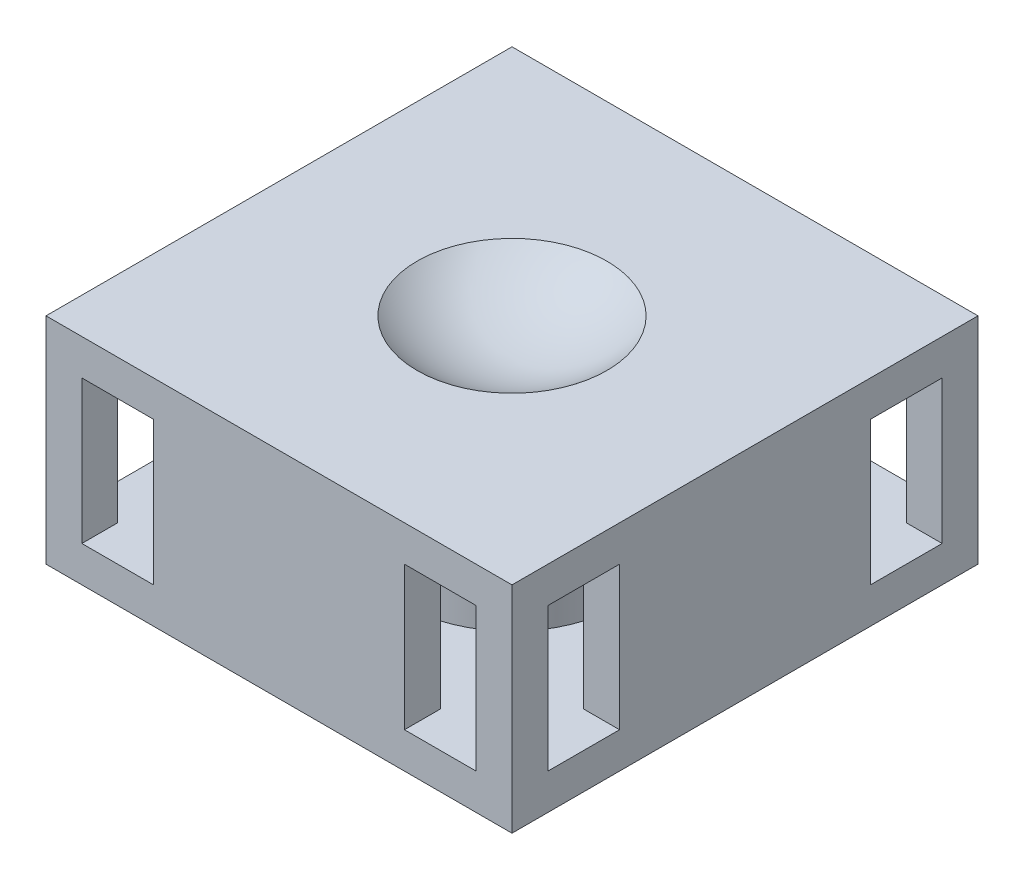
ISO-10303-21;
HEADER;
FILE_DESCRIPTION(('STEP AP214'),'2;1');
FILE_NAME('part.step','',(''),(''),'','','');
FILE_SCHEMA(('AUTOMOTIVE_DESIGN { 1 0 10303 214 1 1 1 1 }'));
ENDSEC;
DATA;
#1=APPLICATION_CONTEXT('core data for automotive mechanical design processes');
#2=APPLICATION_PROTOCOL_DEFINITION('international standard','automotive_design',2000,#1);
#3=PRODUCT_CONTEXT('',#1,'mechanical');
#4=PRODUCT('Part','Part','',(#3));
#5=PRODUCT_RELATED_PRODUCT_CATEGORY('part','',(#4));
#6=PRODUCT_DEFINITION_FORMATION('','',#4);
#7=PRODUCT_DEFINITION_CONTEXT('part definition',#1,'design');
#8=PRODUCT_DEFINITION('design','',#6,#7);
#9=PRODUCT_DEFINITION_SHAPE('','',#8);
#10=(LENGTH_UNIT() NAMED_UNIT(*) SI_UNIT(.MILLI.,.METRE.));
#11=(NAMED_UNIT(*) PLANE_ANGLE_UNIT() SI_UNIT($,.RADIAN.));
#12=(NAMED_UNIT(*) SI_UNIT($,.STERADIAN.) SOLID_ANGLE_UNIT());
#13=UNCERTAINTY_MEASURE_WITH_UNIT(LENGTH_MEASURE(1.E-05),#10,'distance_accuracy_value','');
#14=(GEOMETRIC_REPRESENTATION_CONTEXT(3) GLOBAL_UNCERTAINTY_ASSIGNED_CONTEXT((#13)) GLOBAL_UNIT_ASSIGNED_CONTEXT((#10,
#11,#12)) REPRESENTATION_CONTEXT('',''));
#15=CARTESIAN_POINT('',(0.,0.,0.));
#16=DIRECTION('',(0.,0.,1.));
#17=DIRECTION('',(1.,0.,0.));
#18=AXIS2_PLACEMENT_3D('',#15,#16,#17);
#19=CARTESIAN_POINT('',(77.4408521018582,-20.,40.9027976581447));
#20=DIRECTION('',(0.,0.,1.));
#21=DIRECTION('',(1.,0.,0.));
#22=AXIS2_PLACEMENT_3D('',#19,#20,#21);
#23=PLANE('',#22);
#24=DIRECTION('',(-1.,0.,0.));
#25=VECTOR('',#24,1.);
#26=CARTESIAN_POINT('',(77.4408521018582,-40.,40.9027976581447));
#27=LINE('',#26,#25);
#28=CARTESIAN_POINT('',(77.4408521018582,-40.,40.9027976581447));
#29=VERTEX_POINT('',#28);
#30=CARTESIAN_POINT('',(72.4408521018581,-40.,40.9027976581447));
#31=VERTEX_POINT('',#30);
#32=EDGE_CURVE('E500',#29,#31,#27,.T.);
#33=ORIENTED_EDGE('',*,*,#32,.T.);
#34=DIRECTION('',(0.,1.,0.));
#35=VECTOR('',#34,1.);
#36=CARTESIAN_POINT('',(72.4408521018581,-20.,40.9027976581447));
#37=LINE('',#36,#35);
#38=CARTESIAN_POINT('',(72.4408521018581,-20.,40.9027976581447));
#39=VERTEX_POINT('',#38);
#40=EDGE_CURVE('E303',#31,#39,#37,.T.);
#41=ORIENTED_EDGE('',*,*,#40,.T.);
#42=DIRECTION('',(-1.,0.,0.));
#43=VECTOR('',#42,1.);
#44=CARTESIAN_POINT('',(77.4408521018582,-20.,40.9027976581447));
#45=LINE('',#44,#43);
#46=CARTESIAN_POINT('',(77.4408521018582,-20.,40.9027976581447));
#47=VERTEX_POINT('',#46);
#48=EDGE_CURVE('E444',#47,#39,#45,.T.);
#49=ORIENTED_EDGE('',*,*,#48,.F.);
#50=DIRECTION('',(0.,1.,0.));
#51=VECTOR('',#50,1.);
#52=CARTESIAN_POINT('',(77.4408521018582,-20.,40.9027976581447));
#53=LINE('',#52,#51);
#54=EDGE_CURVE('E482',#29,#47,#53,.T.);
#55=ORIENTED_EDGE('',*,*,#54,.F.);
#56=EDGE_LOOP('',(#33,#41,#49,#55));
#57=FACE_BOUND('',#56,.T.);
#58=ADVANCED_FACE('F39',(#57),#23,.F.);
#59=CARTESIAN_POINT('',(62.4408521018581,-20.,40.9027976581447));
#60=VERTEX_POINT('',#59);
#61=CARTESIAN_POINT('',(27.4408521018581,-20.,40.9027976581447));
#62=VERTEX_POINT('',#61);
#63=EDGE_CURVE('E498',#60,#62,#45,.T.);
#64=ORIENTED_EDGE('',*,*,#63,.F.);
#65=DIRECTION('',(0.,-1.,0.));
#66=VECTOR('',#65,1.);
#67=CARTESIAN_POINT('',(62.4408521018581,-20.,40.9027976581447));
#68=LINE('',#67,#66);
#69=CARTESIAN_POINT('',(62.4408521018581,-40.,40.9027976581447));
#70=VERTEX_POINT('',#69);
#71=EDGE_CURVE('E412',#60,#70,#68,.T.);
#72=ORIENTED_EDGE('',*,*,#71,.T.);
#73=CARTESIAN_POINT('',(27.4408521018581,-40.,40.9027976581447));
#74=VERTEX_POINT('',#73);
#75=EDGE_CURVE('E502',#70,#74,#27,.T.);
#76=ORIENTED_EDGE('',*,*,#75,.T.);
#77=DIRECTION('',(0.,1.,0.));
#78=VECTOR('',#77,1.);
#79=CARTESIAN_POINT('',(27.4408521018581,-20.,40.9027976581447));
#80=LINE('',#79,#78);
#81=EDGE_CURVE('E406',#74,#62,#80,.T.);
#82=ORIENTED_EDGE('',*,*,#81,.T.);
#83=EDGE_LOOP('',(#64,#72,#76,#82));
#84=FACE_BOUND('',#83,.T.);
#85=ADVANCED_FACE('F661',(#84),#23,.F.);
#86=CARTESIAN_POINT('',(77.4408521018582,-20.,30.9027976581447));
#87=DIRECTION('',(0.,0.,-1.));
#88=DIRECTION('',(0.,1.,0.));
#89=AXIS2_PLACEMENT_3D('',#86,#87,#88);
#90=PLANE('',#89);
#91=DIRECTION('',(-1.,0.,0.));
#92=VECTOR('',#91,1.);
#93=CARTESIAN_POINT('',(77.4408521018582,-20.,30.9027976581447));
#94=LINE('',#93,#92);
#95=CARTESIAN_POINT('',(77.4408521018582,-20.,30.9027976581447));
#96=VERTEX_POINT('',#95);
#97=CARTESIAN_POINT('',(72.4408521018581,-20.,30.9027976581447));
#98=VERTEX_POINT('',#97);
#99=EDGE_CURVE('E509',#96,#98,#94,.T.);
#100=ORIENTED_EDGE('',*,*,#99,.T.);
#101=DIRECTION('',(0.,-1.,0.));
#102=VECTOR('',#101,1.);
#103=CARTESIAN_POINT('',(72.4408521018581,-20.,30.9027976581447));
#104=LINE('',#103,#102);
#105=CARTESIAN_POINT('',(72.4408521018581,-40.,30.9027976581447));
#106=VERTEX_POINT('',#105);
#107=EDGE_CURVE('E421',#98,#106,#104,.T.);
#108=ORIENTED_EDGE('',*,*,#107,.T.);
#109=DIRECTION('',(-1.,0.,0.));
#110=VECTOR('',#109,1.);
#111=CARTESIAN_POINT('',(77.4408521018582,-40.,30.9027976581447));
#112=LINE('',#111,#110);
#113=CARTESIAN_POINT('',(77.4408521018581,-40.,30.9027976581447));
#114=VERTEX_POINT('',#113);
#115=EDGE_CURVE('E504',#114,#106,#112,.T.);
#116=ORIENTED_EDGE('',*,*,#115,.F.);
#117=DIRECTION('',(0.,-1.,0.));
#118=VECTOR('',#117,1.);
#119=CARTESIAN_POINT('',(77.4408521018582,-20.,30.9027976581447));
#120=LINE('',#119,#118);
#121=EDGE_CURVE('E475',#96,#114,#120,.T.);
#122=ORIENTED_EDGE('',*,*,#121,.F.);
#123=EDGE_LOOP('',(#100,#108,#116,#122));
#124=FACE_BOUND('',#123,.T.);
#125=ADVANCED_FACE('F705',(#124),#90,.F.);
#126=CARTESIAN_POINT('',(47.4408521018581,-20.,30.9027976581447));
#127=VERTEX_POINT('',#126);
#128=CARTESIAN_POINT('',(42.4408521018581,-20.,30.9027976581447));
#129=VERTEX_POINT('',#128);
#130=EDGE_CURVE('E512',#127,#129,#94,.T.);
#131=ORIENTED_EDGE('',*,*,#130,.T.);
#132=DIRECTION('',(0.,-1.,0.));
#133=VECTOR('',#132,1.);
#134=CARTESIAN_POINT('',(42.4408521018581,-20.,30.9027976581447));
#135=LINE('',#134,#133);
#136=CARTESIAN_POINT('',(42.4408521018581,-40.,30.9027976581447));
#137=VERTEX_POINT('',#136);
#138=EDGE_CURVE('E560',#129,#137,#135,.T.);
#139=ORIENTED_EDGE('',*,*,#138,.T.);
#140=CARTESIAN_POINT('',(47.4408521018581,-40.,30.9027976581447));
#141=VERTEX_POINT('',#140);
#142=EDGE_CURVE('E507',#141,#137,#112,.T.);
#143=ORIENTED_EDGE('',*,*,#142,.F.);
#144=DIRECTION('',(0.,1.,0.));
#145=VECTOR('',#144,1.);
#146=CARTESIAN_POINT('',(47.4408521018581,-20.,30.9027976581447));
#147=LINE('',#146,#145);
#148=EDGE_CURVE('E557',#141,#127,#147,.T.);
#149=ORIENTED_EDGE('',*,*,#148,.T.);
#150=EDGE_LOOP('',(#131,#139,#143,#149));
#151=FACE_BOUND('',#150,.T.);
#152=ADVANCED_FACE('F714',(#151),#90,.F.);
#153=CARTESIAN_POINT('',(77.4408521018581,-20.,-14.0972023418553));
#154=DIRECTION('',(0.,0.,-1.));
#155=DIRECTION('',(-1.,0.,0.));
#156=AXIS2_PLACEMENT_3D('',#153,#154,#155);
#157=PLANE('',#156);
#158=DIRECTION('',(-1.,0.,0.));
#159=VECTOR('',#158,1.);
#160=CARTESIAN_POINT('',(77.4408521018581,-20.,-14.0972023418553));
#161=LINE('',#160,#159);
#162=CARTESIAN_POINT('',(77.4408521018581,-20.,-14.0972023418553));
#163=VERTEX_POINT('',#162);
#164=CARTESIAN_POINT('',(72.4408521018581,-20.,-14.0972023418553));
#165=VERTEX_POINT('',#164);
#166=EDGE_CURVE('E452',#163,#165,#161,.T.);
#167=ORIENTED_EDGE('',*,*,#166,.T.);
#168=DIRECTION('',(0.,-1.,0.));
#169=VECTOR('',#168,1.);
#170=CARTESIAN_POINT('',(72.4408521018581,-20.,-14.0972023418553));
#171=LINE('',#170,#169);
#172=CARTESIAN_POINT('',(72.4408521018581,-40.,-14.0972023418553));
#173=VERTEX_POINT('',#172);
#174=EDGE_CURVE('E418',#165,#173,#171,.T.);
#175=ORIENTED_EDGE('',*,*,#174,.T.);
#176=DIRECTION('',(-1.,0.,0.));
#177=VECTOR('',#176,1.);
#178=CARTESIAN_POINT('',(77.4408521018581,-40.,-14.0972023418553));
#179=LINE('',#178,#177);
#180=CARTESIAN_POINT('',(77.4408521018581,-40.,-14.0972023418553));
#181=VERTEX_POINT('',#180);
#182=EDGE_CURVE('E468',#181,#173,#179,.T.);
#183=ORIENTED_EDGE('',*,*,#182,.F.);
#184=DIRECTION('',(0.,-1.,0.));
#185=VECTOR('',#184,1.);
#186=CARTESIAN_POINT('',(77.4408521018581,-20.,-14.0972023418553));
#187=LINE('',#186,#185);
#188=EDGE_CURVE('E426',#163,#181,#187,.T.);
#189=ORIENTED_EDGE('',*,*,#188,.F.);
#190=EDGE_LOOP('',(#167,#175,#183,#189));
#191=FACE_BOUND('',#190,.T.);
#192=ADVANCED_FACE('F747',(#191),#157,.F.);
#193=CARTESIAN_POINT('',(62.4408521018581,-40.,-14.0972023418553));
#194=VERTEX_POINT('',#193);
#195=CARTESIAN_POINT('',(27.4408521018581,-40.,-14.0972023418553));
#196=VERTEX_POINT('',#195);
#197=EDGE_CURVE('E471',#194,#196,#179,.T.);
#198=ORIENTED_EDGE('',*,*,#197,.F.);
#199=DIRECTION('',(0.,1.,0.));
#200=VECTOR('',#199,1.);
#201=CARTESIAN_POINT('',(62.4408521018581,-20.,-14.0972023418553));
#202=LINE('',#201,#200);
#203=CARTESIAN_POINT('',(62.4408521018581,-20.,-14.0972023418553));
#204=VERTEX_POINT('',#203);
#205=EDGE_CURVE('E409',#194,#204,#202,.T.);
#206=ORIENTED_EDGE('',*,*,#205,.T.);
#207=CARTESIAN_POINT('',(27.4408521018581,-20.,-14.0972023418553));
#208=VERTEX_POINT('',#207);
#209=EDGE_CURVE('E456',#204,#208,#161,.T.);
#210=ORIENTED_EDGE('',*,*,#209,.T.);
#211=DIRECTION('',(0.,-1.,0.));
#212=VECTOR('',#211,1.);
#213=CARTESIAN_POINT('',(27.4408521018581,-20.,-14.0972023418553));
#214=LINE('',#213,#212);
#215=EDGE_CURVE('E403',#208,#196,#214,.T.);
#216=ORIENTED_EDGE('',*,*,#215,.T.);
#217=EDGE_LOOP('',(#198,#206,#210,#216));
#218=FACE_BOUND('',#217,.T.);
#219=ADVANCED_FACE('F614',(#218),#157,.F.);
#220=CARTESIAN_POINT('',(77.4408521018581,-20.,-4.09720234185532));
#221=DIRECTION('',(0.,0.,1.));
#222=DIRECTION('',(0.,-1.,0.));
#223=AXIS2_PLACEMENT_3D('',#220,#221,#222);
#224=PLANE('',#223);
#225=DIRECTION('',(-1.,0.,0.));
#226=VECTOR('',#225,1.);
#227=CARTESIAN_POINT('',(77.4408521018581,-40.,-4.09720234185531));
#228=LINE('',#227,#226);
#229=CARTESIAN_POINT('',(77.4408521018581,-40.,-4.0972023418553));
#230=VERTEX_POINT('',#229);
#231=CARTESIAN_POINT('',(72.4408521018581,-40.,-4.09720234185531));
#232=VERTEX_POINT('',#231);
#233=EDGE_CURVE('E463',#230,#232,#228,.T.);
#234=ORIENTED_EDGE('',*,*,#233,.T.);
#235=DIRECTION('',(0.,1.,0.));
#236=VECTOR('',#235,1.);
#237=CARTESIAN_POINT('',(72.4408521018581,-20.,-4.09720234185531));
#238=LINE('',#237,#236);
#239=CARTESIAN_POINT('',(72.4408521018581,-20.,-4.09720234185532));
#240=VERTEX_POINT('',#239);
#241=EDGE_CURVE('E415',#232,#240,#238,.T.);
#242=ORIENTED_EDGE('',*,*,#241,.T.);
#243=DIRECTION('',(-1.,0.,0.));
#244=VECTOR('',#243,1.);
#245=CARTESIAN_POINT('',(77.4408521018581,-20.,-4.09720234185532));
#246=LINE('',#245,#244);
#247=CARTESIAN_POINT('',(77.4408521018581,-20.,-4.09720234185532));
#248=VERTEX_POINT('',#247);
#249=EDGE_CURVE('E458',#248,#240,#246,.T.);
#250=ORIENTED_EDGE('',*,*,#249,.F.);
#251=DIRECTION('',(0.,1.,0.));
#252=VECTOR('',#251,1.);
#253=CARTESIAN_POINT('',(77.4408521018581,-20.,-4.09720234185532));
#254=LINE('',#253,#252);
#255=EDGE_CURVE('E433',#230,#248,#254,.T.);
#256=ORIENTED_EDGE('',*,*,#255,.F.);
#257=EDGE_LOOP('',(#234,#242,#250,#256));
#258=FACE_BOUND('',#257,.T.);
#259=ADVANCED_FACE('F696',(#258),#224,.F.);
#260=CARTESIAN_POINT('',(47.4408521018581,-40.,-4.09720234185531));
#261=VERTEX_POINT('',#260);
#262=CARTESIAN_POINT('',(42.4408521018581,-40.,-4.09720234185531));
#263=VERTEX_POINT('',#262);
#264=EDGE_CURVE('E466',#261,#263,#228,.T.);
#265=ORIENTED_EDGE('',*,*,#264,.T.);
#266=DIRECTION('',(0.,1.,0.));
#267=VECTOR('',#266,1.);
#268=CARTESIAN_POINT('',(42.4408521018581,-20.,-4.09720234185531));
#269=LINE('',#268,#267);
#270=CARTESIAN_POINT('',(42.4408521018581,-20.,-4.09720234185531));
#271=VERTEX_POINT('',#270);
#272=EDGE_CURVE('E550',#263,#271,#269,.T.);
#273=ORIENTED_EDGE('',*,*,#272,.T.);
#274=CARTESIAN_POINT('',(47.4408521018581,-20.,-4.09720234185531));
#275=VERTEX_POINT('',#274);
#276=EDGE_CURVE('E461',#275,#271,#246,.T.);
#277=ORIENTED_EDGE('',*,*,#276,.F.);
#278=DIRECTION('',(0.,-1.,0.));
#279=VECTOR('',#278,1.);
#280=CARTESIAN_POINT('',(47.4408521018581,-20.,-4.09720234185531));
#281=LINE('',#280,#279);
#282=EDGE_CURVE('E537',#275,#261,#281,.T.);
#283=ORIENTED_EDGE('',*,*,#282,.T.);
#284=EDGE_LOOP('',(#265,#273,#277,#283));
#285=FACE_BOUND('',#284,.T.);
#286=ADVANCED_FACE('F590',(#285),#224,.F.);
#287=CARTESIAN_POINT('',(12.4408521018581,-45.,-19.0972023418553));
#288=DIRECTION('',(-1.,0.,0.));
#289=DIRECTION('',(0.,0.,1.));
#290=AXIS2_PLACEMENT_3D('',#287,#288,#289);
#291=PLANE('',#290);
#292=DIRECTION('',(0.,-1.,0.));
#293=VECTOR('',#292,1.);
#294=CARTESIAN_POINT('',(12.4408521018581,-20.,-14.0972023418553));
#295=LINE('',#294,#293);
#296=CARTESIAN_POINT('',(12.4408521018581,-20.,-14.0972023418553));
#297=VERTEX_POINT('',#296);
#298=CARTESIAN_POINT('',(12.4408521018581,-40.,-14.0972023418553));
#299=VERTEX_POINT('',#298);
#300=EDGE_CURVE('E440',#297,#299,#295,.T.);
#301=ORIENTED_EDGE('',*,*,#300,.F.);
#302=DIRECTION('',(0.,0.,-1.));
#303=VECTOR('',#302,1.);
#304=CARTESIAN_POINT('',(12.4408521018581,-20.,-14.0972023418553));
#305=LINE('',#304,#303);
#306=CARTESIAN_POINT('',(12.4408521018581,-20.,-4.09720234185531));
#307=VERTEX_POINT('',#306);
#308=EDGE_CURVE('E430',#307,#297,#305,.T.);
#309=ORIENTED_EDGE('',*,*,#308,.F.);
#310=DIRECTION('',(0.,1.,0.));
#311=VECTOR('',#310,1.);
#312=CARTESIAN_POINT('',(12.4408521018581,-20.,-4.09720234185531));
#313=LINE('',#312,#311);
#314=CARTESIAN_POINT('',(12.4408521018581,-40.,-4.0972023418553));
#315=VERTEX_POINT('',#314);
#316=EDGE_CURVE('E447',#315,#307,#313,.T.);
#317=ORIENTED_EDGE('',*,*,#316,.F.);
#318=DIRECTION('',(0.,0.,1.));
#319=VECTOR('',#318,1.);
#320=CARTESIAN_POINT('',(12.4408521018581,-40.,-14.0972023418553));
#321=LINE('',#320,#319);
#322=EDGE_CURVE('E443',#299,#315,#321,.T.);
#323=ORIENTED_EDGE('',*,*,#322,.F.);
#324=EDGE_LOOP('',(#301,#309,#317,#323));
#325=FACE_BOUND('',#324,.T.);
#326=DIRECTION('',(0.,0.,-1.));
#327=VECTOR('',#326,1.);
#328=CARTESIAN_POINT('',(12.4408521018581,-20.,30.9027976581447));
#329=LINE('',#328,#327);
#330=CARTESIAN_POINT('',(12.4408521018581,-20.,40.9027976581447));
#331=VERTEX_POINT('',#330);
#332=CARTESIAN_POINT('',(12.4408521018581,-20.,30.9027976581447));
#333=VERTEX_POINT('',#332);
#334=EDGE_CURVE('E425',#331,#333,#329,.T.);
#335=ORIENTED_EDGE('',*,*,#334,.F.);
#336=DIRECTION('',(0.,1.,0.));
#337=VECTOR('',#336,1.);
#338=CARTESIAN_POINT('',(12.4408521018581,-20.,40.9027976581447));
#339=LINE('',#338,#337);
#340=CARTESIAN_POINT('',(12.4408521018581,-40.,40.9027976581447));
#341=VERTEX_POINT('',#340);
#342=EDGE_CURVE('E476',#341,#331,#339,.T.);
#343=ORIENTED_EDGE('',*,*,#342,.F.);
#344=DIRECTION('',(0.,0.,1.));
#345=VECTOR('',#344,1.);
#346=CARTESIAN_POINT('',(12.4408521018581,-40.,30.9027976581447));
#347=LINE('',#346,#345);
#348=CARTESIAN_POINT('',(12.4408521018581,-40.,30.9027976581447));
#349=VERTEX_POINT('',#348);
#350=EDGE_CURVE('E491',#349,#341,#347,.T.);
#351=ORIENTED_EDGE('',*,*,#350,.F.);
#352=DIRECTION('',(0.,-1.,0.));
#353=VECTOR('',#352,1.);
#354=CARTESIAN_POINT('',(12.4408521018581,-20.,30.9027976581447));
#355=LINE('',#354,#353);
#356=EDGE_CURVE('E488',#333,#349,#355,.T.);
#357=ORIENTED_EDGE('',*,*,#356,.F.);
#358=EDGE_LOOP('',(#335,#343,#351,#357));
#359=FACE_BOUND('',#358,.T.);
#360=DIRECTION('',(0.,1.,0.));
#361=VECTOR('',#360,1.);
#362=CARTESIAN_POINT('',(12.4408521018581,-45.,45.9027976581447));
#363=LINE('',#362,#361);
#364=CARTESIAN_POINT('',(12.4408521018581,-45.,45.9027976581447));
#365=VERTEX_POINT('',#364);
#366=CARTESIAN_POINT('',(12.4408521018581,-15.,45.9027976581447));
#367=VERTEX_POINT('',#366);
#368=EDGE_CURVE('E533',#365,#367,#363,.T.);
#369=ORIENTED_EDGE('',*,*,#368,.T.);
#370=DIRECTION('',(0.,0.,1.));
#371=VECTOR('',#370,1.);
#372=CARTESIAN_POINT('',(12.4408521018581,-15.,-19.0972023418553));
#373=LINE('',#372,#371);
#374=CARTESIAN_POINT('',(12.4408521018581,-15.,-19.0972023418553));
#375=VERTEX_POINT('',#374);
#376=EDGE_CURVE('E455',#375,#367,#373,.T.);
#377=ORIENTED_EDGE('',*,*,#376,.F.);
#378=DIRECTION('',(0.,1.,0.));
#379=VECTOR('',#378,1.);
#380=CARTESIAN_POINT('',(12.4408521018581,-45.,-19.0972023418553));
#381=LINE('',#380,#379);
#382=CARTESIAN_POINT('',(12.4408521018581,-45.,-19.0972023418553));
#383=VERTEX_POINT('',#382);
#384=EDGE_CURVE('E534',#383,#375,#381,.T.);
#385=ORIENTED_EDGE('',*,*,#384,.F.);
#386=DIRECTION('',(0.,0.,1.));
#387=VECTOR('',#386,1.);
#388=CARTESIAN_POINT('',(12.4408521018581,-45.,-19.0972023418553));
#389=LINE('',#388,#387);
#390=EDGE_CURVE('E521',#383,#365,#389,.T.);
#391=ORIENTED_EDGE('',*,*,#390,.T.);
#392=EDGE_LOOP('',(#369,#377,#385,#391));
#393=FACE_BOUND('',#392,.T.);
#394=ADVANCED_FACE('F604',(#325,#359,#393),#291,.T.);
#395=CARTESIAN_POINT('',(12.4408521018581,-45.,-19.0972023418553));
#396=DIRECTION('',(0.,0.,-1.));
#397=DIRECTION('',(-1.,0.,0.));
#398=AXIS2_PLACEMENT_3D('',#395,#396,#397);
#399=PLANE('',#398);
#400=DIRECTION('',(0.,-1.,0.));
#401=VECTOR('',#400,1.);
#402=CARTESIAN_POINT('',(72.4408521018581,-20.,-19.0972023418553));
#403=LINE('',#402,#401);
#404=CARTESIAN_POINT('',(72.4408521018581,-20.,-19.0972023418553));
#405=VERTEX_POINT('',#404);
#406=CARTESIAN_POINT('',(72.4408521018581,-40.,-19.0972023418553));
#407=VERTEX_POINT('',#406);
#408=EDGE_CURVE('E333',#405,#407,#403,.T.);
#409=ORIENTED_EDGE('',*,*,#408,.F.);
#410=DIRECTION('',(1.,0.,0.));
#411=VECTOR('',#410,1.);
#412=CARTESIAN_POINT('',(72.4408521018581,-20.,-19.0972023418553));
#413=LINE('',#412,#411);
#414=CARTESIAN_POINT('',(62.4408521018581,-20.,-19.0972023418553));
#415=VERTEX_POINT('',#414);
#416=EDGE_CURVE('E325',#415,#405,#413,.T.);
#417=ORIENTED_EDGE('',*,*,#416,.F.);
#418=DIRECTION('',(0.,1.,0.));
#419=VECTOR('',#418,1.);
#420=CARTESIAN_POINT('',(62.4408521018581,-20.,-19.0972023418553));
#421=LINE('',#420,#419);
#422=CARTESIAN_POINT('',(62.4408521018581,-40.,-19.0972023418553));
#423=VERTEX_POINT('',#422);
#424=EDGE_CURVE('E328',#423,#415,#421,.T.);
#425=ORIENTED_EDGE('',*,*,#424,.F.);
#426=DIRECTION('',(-1.,0.,0.));
#427=VECTOR('',#426,1.);
#428=CARTESIAN_POINT('',(72.4408521018581,-40.,-19.0972023418553));
#429=LINE('',#428,#427);
#430=EDGE_CURVE('E335',#407,#423,#429,.T.);
#431=ORIENTED_EDGE('',*,*,#430,.F.);
#432=EDGE_LOOP('',(#409,#417,#425,#431));
#433=FACE_BOUND('',#432,.T.);
#434=DIRECTION('',(0.,-1.,0.));
#435=VECTOR('',#434,1.);
#436=CARTESIAN_POINT('',(27.4408521018581,-20.,-19.0972023418553));
#437=LINE('',#436,#435);
#438=CARTESIAN_POINT('',(27.4408521018581,-20.,-19.0972023418553));
#439=VERTEX_POINT('',#438);
#440=CARTESIAN_POINT('',(27.4408521018581,-40.,-19.0972023418553));
#441=VERTEX_POINT('',#440);
#442=EDGE_CURVE('E367',#439,#441,#437,.T.);
#443=ORIENTED_EDGE('',*,*,#442,.F.);
#444=DIRECTION('',(1.,0.,0.));
#445=VECTOR('',#444,1.);
#446=CARTESIAN_POINT('',(27.4408521018581,-20.,-19.0972023418553));
#447=LINE('',#446,#445);
#448=CARTESIAN_POINT('',(17.4408521018581,-20.,-19.0972023418553));
#449=VERTEX_POINT('',#448);
#450=EDGE_CURVE('E357',#449,#439,#447,.T.);
#451=ORIENTED_EDGE('',*,*,#450,.F.);
#452=DIRECTION('',(0.,1.,0.));
#453=VECTOR('',#452,1.);
#454=CARTESIAN_POINT('',(17.4408521018581,-20.,-19.0972023418553));
#455=LINE('',#454,#453);
#456=CARTESIAN_POINT('',(17.4408521018581,-40.,-19.0972023418553));
#457=VERTEX_POINT('',#456);
#458=EDGE_CURVE('E372',#457,#449,#455,.T.);
#459=ORIENTED_EDGE('',*,*,#458,.F.);
#460=DIRECTION('',(-1.,0.,0.));
#461=VECTOR('',#460,1.);
#462=CARTESIAN_POINT('',(27.4408521018581,-40.,-19.0972023418553));
#463=LINE('',#462,#461);
#464=EDGE_CURVE('E369',#441,#457,#463,.T.);
#465=ORIENTED_EDGE('',*,*,#464,.F.);
#466=EDGE_LOOP('',(#443,#451,#459,#465));
#467=FACE_BOUND('',#466,.T.);
#468=ORIENTED_EDGE('',*,*,#384,.T.);
#469=DIRECTION('',(-1.,0.,0.));
#470=VECTOR('',#469,1.);
#471=CARTESIAN_POINT('',(12.4408521018581,-15.,-19.0972023418553));
#472=LINE('',#471,#470);
#473=CARTESIAN_POINT('',(77.4408521018581,-15.,-19.0972023418553));
#474=VERTEX_POINT('',#473);
#475=EDGE_CURVE('E518',#474,#375,#472,.T.);
#476=ORIENTED_EDGE('',*,*,#475,.F.);
#477=DIRECTION('',(0.,1.,0.));
#478=VECTOR('',#477,1.);
#479=CARTESIAN_POINT('',(77.4408521018581,-45.,-19.0972023418553));
#480=LINE('',#479,#478);
#481=CARTESIAN_POINT('',(77.4408521018581,-45.,-19.0972023418553));
#482=VERTEX_POINT('',#481);
#483=EDGE_CURVE('E538',#482,#474,#480,.T.);
#484=ORIENTED_EDGE('',*,*,#483,.F.);
#485=DIRECTION('',(-1.,0.,0.));
#486=VECTOR('',#485,1.);
#487=CARTESIAN_POINT('',(12.4408521018581,-45.,-19.0972023418553));
#488=LINE('',#487,#486);
#489=EDGE_CURVE('E530',#482,#383,#488,.T.);
#490=ORIENTED_EDGE('',*,*,#489,.T.);
#491=EDGE_LOOP('',(#468,#476,#484,#490));
#492=FACE_BOUND('',#491,.T.);
#493=ADVANCED_FACE('F638',(#433,#467,#492),#399,.T.);
#494=CARTESIAN_POINT('',(77.4408521018581,-45.,-19.0972023418553));
#495=DIRECTION('',(1.,0.,0.));
#496=DIRECTION('',(0.,0.,-1.));
#497=AXIS2_PLACEMENT_3D('',#494,#495,#496);
#498=PLANE('',#497);
#499=ORIENTED_EDGE('',*,*,#188,.T.);
#500=DIRECTION('',(0.,0.,1.));
#501=VECTOR('',#500,1.);
#502=CARTESIAN_POINT('',(77.4408521018581,-40.,-14.0972023418553));
#503=LINE('',#502,#501);
#504=EDGE_CURVE('E429',#181,#230,#503,.T.);
#505=ORIENTED_EDGE('',*,*,#504,.T.);
#506=ORIENTED_EDGE('',*,*,#255,.T.);
#507=DIRECTION('',(0.,0.,-1.));
#508=VECTOR('',#507,1.);
#509=CARTESIAN_POINT('',(77.4408521018581,-20.,-14.0972023418553));
#510=LINE('',#509,#508);
#511=EDGE_CURVE('E436',#248,#163,#510,.T.);
#512=ORIENTED_EDGE('',*,*,#511,.T.);
#513=EDGE_LOOP('',(#499,#505,#506,#512));
#514=FACE_BOUND('',#513,.T.);
#515=DIRECTION('',(0.,0.,-1.));
#516=VECTOR('',#515,1.);
#517=CARTESIAN_POINT('',(77.4408521018582,-20.,30.9027976581447));
#518=LINE('',#517,#516);
#519=EDGE_CURVE('E472',#47,#96,#518,.T.);
#520=ORIENTED_EDGE('',*,*,#519,.T.);
#521=ORIENTED_EDGE('',*,*,#121,.T.);
#522=DIRECTION('',(0.,0.,1.));
#523=VECTOR('',#522,1.);
#524=CARTESIAN_POINT('',(77.4408521018582,-40.,30.9027976581447));
#525=LINE('',#524,#523);
#526=EDGE_CURVE('E479',#114,#29,#525,.T.);
#527=ORIENTED_EDGE('',*,*,#526,.T.);
#528=ORIENTED_EDGE('',*,*,#54,.T.);
#529=EDGE_LOOP('',(#520,#521,#527,#528));
#530=FACE_BOUND('',#529,.T.);
#531=ORIENTED_EDGE('',*,*,#483,.T.);
#532=DIRECTION('',(0.,0.,-1.));
#533=VECTOR('',#532,1.);
#534=CARTESIAN_POINT('',(77.4408521018581,-15.,-19.0972023418553));
#535=LINE('',#534,#533);
#536=CARTESIAN_POINT('',(77.4408521018581,-15.,45.9027976581447));
#537=VERTEX_POINT('',#536);
#538=EDGE_CURVE('E516',#537,#474,#535,.T.);
#539=ORIENTED_EDGE('',*,*,#538,.F.);
#540=DIRECTION('',(0.,1.,0.));
#541=VECTOR('',#540,1.);
#542=CARTESIAN_POINT('',(77.4408521018581,-45.,45.9027976581447));
#543=LINE('',#542,#541);
#544=CARTESIAN_POINT('',(77.4408521018581,-45.,45.9027976581447));
#545=VERTEX_POINT('',#544);
#546=EDGE_CURVE('E541',#545,#537,#543,.T.);
#547=ORIENTED_EDGE('',*,*,#546,.F.);
#548=DIRECTION('',(0.,0.,-1.));
#549=VECTOR('',#548,1.);
#550=CARTESIAN_POINT('',(77.4408521018581,-45.,-19.0972023418553));
#551=LINE('',#550,#549);
#552=EDGE_CURVE('E527',#545,#482,#551,.T.);
#553=ORIENTED_EDGE('',*,*,#552,.T.);
#554=EDGE_LOOP('',(#531,#539,#547,#553));
#555=FACE_BOUND('',#554,.T.);
#556=ADVANCED_FACE('F674',(#514,#530,#555),#498,.T.);
#557=CARTESIAN_POINT('',(12.4408521018581,-45.,45.9027976581447));
#558=DIRECTION('',(0.,0.,1.));
#559=DIRECTION('',(1.,0.,0.));
#560=AXIS2_PLACEMENT_3D('',#557,#558,#559);
#561=PLANE('',#560);
#562=DIRECTION('',(0.,-1.,0.));
#563=VECTOR('',#562,1.);
#564=CARTESIAN_POINT('',(72.4408521018581,-20.,45.9027976581447));
#565=LINE('',#564,#563);
#566=CARTESIAN_POINT('',(72.4408521018581,-20.,45.9027976581447));
#567=VERTEX_POINT('',#566);
#568=CARTESIAN_POINT('',(72.4408521018581,-40.,45.9027976581447));
#569=VERTEX_POINT('',#568);
#570=EDGE_CURVE('E300',#567,#569,#565,.T.);
#571=ORIENTED_EDGE('',*,*,#570,.T.);
#572=DIRECTION('',(-1.,0.,0.));
#573=VECTOR('',#572,1.);
#574=CARTESIAN_POINT('',(72.4408521018581,-40.,45.9027976581447));
#575=LINE('',#574,#573);
#576=CARTESIAN_POINT('',(62.4408521018581,-40.,45.9027976581447));
#577=VERTEX_POINT('',#576);
#578=EDGE_CURVE('E312',#569,#577,#575,.T.);
#579=ORIENTED_EDGE('',*,*,#578,.T.);
#580=DIRECTION('',(0.,1.,0.));
#581=VECTOR('',#580,1.);
#582=CARTESIAN_POINT('',(62.4408521018581,-20.,45.9027976581447));
#583=LINE('',#582,#581);
#584=CARTESIAN_POINT('',(62.4408521018581,-20.,45.9027976581447));
#585=VERTEX_POINT('',#584);
#586=EDGE_CURVE('E319',#577,#585,#583,.T.);
#587=ORIENTED_EDGE('',*,*,#586,.T.);
#588=DIRECTION('',(1.,0.,0.));
#589=VECTOR('',#588,1.);
#590=CARTESIAN_POINT('',(72.4408521018581,-20.,45.9027976581447));
#591=LINE('',#590,#589);
#592=EDGE_CURVE('E324',#585,#567,#591,.T.);
#593=ORIENTED_EDGE('',*,*,#592,.T.);
#594=EDGE_LOOP('',(#571,#579,#587,#593));
#595=FACE_BOUND('',#594,.T.);
#596=DIRECTION('',(0.,-1.,0.));
#597=VECTOR('',#596,1.);
#598=CARTESIAN_POINT('',(27.4408521018581,-20.,45.9027976581447));
#599=LINE('',#598,#597);
#600=CARTESIAN_POINT('',(27.4408521018581,-20.,45.9027976581447));
#601=VERTEX_POINT('',#600);
#602=CARTESIAN_POINT('',(27.4408521018581,-40.,45.9027976581447));
#603=VERTEX_POINT('',#602);
#604=EDGE_CURVE('E353',#601,#603,#599,.T.);
#605=ORIENTED_EDGE('',*,*,#604,.T.);
#606=DIRECTION('',(-1.,0.,0.));
#607=VECTOR('',#606,1.);
#608=CARTESIAN_POINT('',(27.4408521018581,-40.,45.9027976581447));
#609=LINE('',#608,#607);
#610=CARTESIAN_POINT('',(17.4408521018581,-40.,45.9027976581447));
#611=VERTEX_POINT('',#610);
#612=EDGE_CURVE('E356',#603,#611,#609,.T.);
#613=ORIENTED_EDGE('',*,*,#612,.T.);
#614=DIRECTION('',(0.,1.,0.));
#615=VECTOR('',#614,1.);
#616=CARTESIAN_POINT('',(17.4408521018581,-20.,45.9027976581447));
#617=LINE('',#616,#615);
#618=CARTESIAN_POINT('',(17.4408521018581,-20.,45.9027976581447));
#619=VERTEX_POINT('',#618);
#620=EDGE_CURVE('E360',#611,#619,#617,.T.);
#621=ORIENTED_EDGE('',*,*,#620,.T.);
#622=DIRECTION('',(1.,0.,0.));
#623=VECTOR('',#622,1.);
#624=CARTESIAN_POINT('',(27.4408521018581,-20.,45.9027976581447));
#625=LINE('',#624,#623);
#626=EDGE_CURVE('E363',#619,#601,#625,.T.);
#627=ORIENTED_EDGE('',*,*,#626,.T.);
#628=EDGE_LOOP('',(#605,#613,#621,#627));
#629=FACE_BOUND('',#628,.T.);
#630=ORIENTED_EDGE('',*,*,#546,.T.);
#631=DIRECTION('',(1.,0.,0.));
#632=VECTOR('',#631,1.);
#633=CARTESIAN_POINT('',(12.4408521018581,-15.,45.9027976581447));
#634=LINE('',#633,#632);
#635=EDGE_CURVE('E514',#367,#537,#634,.T.);
#636=ORIENTED_EDGE('',*,*,#635,.F.);
#637=ORIENTED_EDGE('',*,*,#368,.F.);
#638=DIRECTION('',(1.,0.,0.));
#639=VECTOR('',#638,1.);
#640=CARTESIAN_POINT('',(12.4408521018581,-45.,45.9027976581447));
#641=LINE('',#640,#639);
#642=EDGE_CURVE('E524',#365,#545,#641,.T.);
#643=ORIENTED_EDGE('',*,*,#642,.T.);
#644=EDGE_LOOP('',(#630,#636,#637,#643));
#645=FACE_BOUND('',#644,.T.);
#646=ADVANCED_FACE('F321',(#595,#629,#645),#561,.T.);
#647=CARTESIAN_POINT('',(0.,-45.,0.));
#648=DIRECTION('',(0.,1.,0.));
#649=DIRECTION('',(0.,0.,1.));
#650=AXIS2_PLACEMENT_3D('',#647,#648,#649);
#651=PLANE('',#650);
#652=ORIENTED_EDGE('',*,*,#390,.F.);
#653=ORIENTED_EDGE('',*,*,#489,.F.);
#654=ORIENTED_EDGE('',*,*,#552,.F.);
#655=ORIENTED_EDGE('',*,*,#642,.F.);
#656=EDGE_LOOP('',(#652,#653,#654,#655));
#657=FACE_BOUND('',#656,.T.);
#658=ADVANCED_FACE('F673',(#657),#651,.F.);
#659=CARTESIAN_POINT('',(0.,-15.,0.));
#660=DIRECTION('',(0.,1.,0.));
#661=DIRECTION('',(0.,0.,1.));
#662=AXIS2_PLACEMENT_3D('',#659,#660,#661);
#663=PLANE('',#662);
#664=CARTESIAN_POINT('',(44.9408521018581,-15.,13.4027976581447));
#665=DIRECTION('',(0.,1.,0.));
#666=DIRECTION('',(0.,0.,1.));
#667=AXIS2_PLACEMENT_3D('',#664,#665,#666);
#668=CIRCLE('',#667,13.228756555323);
#669=CARTESIAN_POINT('',(44.9408521018581,-15.,26.6315542134677));
#670=VERTEX_POINT('',#669);
#671=EDGE_CURVE('E520',#670,#670,#668,.T.);
#672=ORIENTED_EDGE('',*,*,#671,.F.);
#673=EDGE_LOOP('',(#672));
#674=FACE_BOUND('',#673,.T.);
#675=ORIENTED_EDGE('',*,*,#376,.T.);
#676=ORIENTED_EDGE('',*,*,#635,.T.);
#677=ORIENTED_EDGE('',*,*,#538,.T.);
#678=ORIENTED_EDGE('',*,*,#475,.T.);
#679=EDGE_LOOP('',(#675,#676,#677,#678));
#680=FACE_BOUND('',#679,.T.);
#681=ADVANCED_FACE('F687',(#674,#680),#663,.T.);
#682=CARTESIAN_POINT('',(44.9408521018581,0.,13.4027976581447));
#683=DIRECTION('',(-1.,0.,0.));
#684=DIRECTION('',(0.,0.,-1.));
#685=AXIS2_PLACEMENT_3D('',#682,#683,#684);
#686=SPHERICAL_SURFACE('',#685,20.);
#687=CARTESIAN_POINT('',(44.9408521018581,0.,13.4027976581447));
#688=DIRECTION('',(0.,1.,0.));
#689=DIRECTION('',(0.,0.,1.));
#690=AXIS2_PLACEMENT_3D('',#687,#688,#689);
#691=SPHERICAL_SURFACE('',#690,20.);
#692=ORIENTED_EDGE('',*,*,#671,.T.);
#693=EDGE_LOOP('',(#692));
#694=FACE_BOUND('',#693,.T.);
#695=ADVANCED_FACE('F709',(#694),#691,.F.);
#696=CARTESIAN_POINT('',(17.4408521018581,-20.,40.9027976581447));
#697=VERTEX_POINT('',#696);
#698=EDGE_CURVE('E499',#697,#331,#45,.T.);
#699=ORIENTED_EDGE('',*,*,#698,.F.);
#700=DIRECTION('',(0.,-1.,0.));
#701=VECTOR('',#700,1.);
#702=CARTESIAN_POINT('',(17.4408521018581,-20.,40.9027976581447));
#703=LINE('',#702,#701);
#704=CARTESIAN_POINT('',(17.4408521018581,-40.,40.9027976581447));
#705=VERTEX_POINT('',#704);
#706=EDGE_CURVE('E400',#697,#705,#703,.T.);
#707=ORIENTED_EDGE('',*,*,#706,.T.);
#708=EDGE_CURVE('E503',#705,#341,#27,.T.);
#709=ORIENTED_EDGE('',*,*,#708,.T.);
#710=ORIENTED_EDGE('',*,*,#342,.T.);
#711=EDGE_LOOP('',(#699,#707,#709,#710));
#712=FACE_BOUND('',#711,.T.);
#713=ADVANCED_FACE('F656',(#712),#23,.F.);
#714=CARTESIAN_POINT('',(17.4408521018581,-40.,30.9027976581447));
#715=VERTEX_POINT('',#714);
#716=EDGE_CURVE('E508',#715,#349,#112,.T.);
#717=ORIENTED_EDGE('',*,*,#716,.F.);
#718=DIRECTION('',(0.,1.,0.));
#719=VECTOR('',#718,1.);
#720=CARTESIAN_POINT('',(17.4408521018581,-20.,30.9027976581447));
#721=LINE('',#720,#719);
#722=CARTESIAN_POINT('',(17.4408521018581,-20.,30.9027976581447));
#723=VERTEX_POINT('',#722);
#724=EDGE_CURVE('E397',#715,#723,#721,.T.);
#725=ORIENTED_EDGE('',*,*,#724,.T.);
#726=EDGE_CURVE('E485',#723,#333,#94,.T.);
#727=ORIENTED_EDGE('',*,*,#726,.T.);
#728=ORIENTED_EDGE('',*,*,#356,.T.);
#729=EDGE_LOOP('',(#717,#725,#727,#728));
#730=FACE_BOUND('',#729,.T.);
#731=ADVANCED_FACE('F651',(#730),#90,.F.);
#732=CARTESIAN_POINT('',(17.4408521018581,-40.,-14.0972023418553));
#733=VERTEX_POINT('',#732);
#734=EDGE_CURVE('E439',#733,#299,#179,.T.);
#735=ORIENTED_EDGE('',*,*,#734,.F.);
#736=DIRECTION('',(0.,1.,0.));
#737=VECTOR('',#736,1.);
#738=CARTESIAN_POINT('',(17.4408521018581,-20.,-14.0972023418553));
#739=LINE('',#738,#737);
#740=CARTESIAN_POINT('',(17.4408521018581,-20.,-14.0972023418553));
#741=VERTEX_POINT('',#740);
#742=EDGE_CURVE('E394',#733,#741,#739,.T.);
#743=ORIENTED_EDGE('',*,*,#742,.T.);
#744=EDGE_CURVE('E457',#741,#297,#161,.T.);
#745=ORIENTED_EDGE('',*,*,#744,.T.);
#746=ORIENTED_EDGE('',*,*,#300,.T.);
#747=EDGE_LOOP('',(#735,#743,#745,#746));
#748=FACE_BOUND('',#747,.T.);
#749=ADVANCED_FACE('F608',(#748),#157,.F.);
#750=CARTESIAN_POINT('',(77.4408521018581,-20.,-14.0972023418553));
#751=DIRECTION('',(0.,1.,0.));
#752=DIRECTION('',(0.,0.,1.));
#753=AXIS2_PLACEMENT_3D('',#750,#751,#752);
#754=PLANE('',#753);
#755=DIRECTION('',(0.,0.,-1.));
#756=VECTOR('',#755,1.);
#757=CARTESIAN_POINT('',(62.4408521018581,-20.,45.9027976581447));
#758=LINE('',#757,#756);
#759=EDGE_CURVE('E346',#585,#60,#758,.T.);
#760=ORIENTED_EDGE('',*,*,#759,.T.);
#761=ORIENTED_EDGE('',*,*,#63,.T.);
#762=DIRECTION('',(0.,0.,-1.));
#763=VECTOR('',#762,1.);
#764=CARTESIAN_POINT('',(27.4408521018581,-20.,45.9027976581447));
#765=LINE('',#764,#763);
#766=EDGE_CURVE('E336',#601,#62,#765,.T.);
#767=ORIENTED_EDGE('',*,*,#766,.F.);
#768=ORIENTED_EDGE('',*,*,#626,.F.);
#769=DIRECTION('',(0.,0.,-1.));
#770=VECTOR('',#769,1.);
#771=CARTESIAN_POINT('',(17.4408521018581,-20.,45.9027976581447));
#772=LINE('',#771,#770);
#773=EDGE_CURVE('E380',#619,#697,#772,.T.);
#774=ORIENTED_EDGE('',*,*,#773,.T.);
#775=ORIENTED_EDGE('',*,*,#698,.T.);
#776=ORIENTED_EDGE('',*,*,#334,.T.);
#777=ORIENTED_EDGE('',*,*,#726,.F.);
#778=CARTESIAN_POINT('',(17.4408521018581,-20.,-4.09720234185531));
#779=VERTEX_POINT('',#778);
#780=EDGE_CURVE('E383',#723,#779,#772,.T.);
#781=ORIENTED_EDGE('',*,*,#780,.T.);
#782=EDGE_CURVE('E462',#779,#307,#246,.T.);
#783=ORIENTED_EDGE('',*,*,#782,.T.);
#784=ORIENTED_EDGE('',*,*,#308,.T.);
#785=ORIENTED_EDGE('',*,*,#744,.F.);
#786=EDGE_CURVE('E384',#741,#449,#772,.T.);
#787=ORIENTED_EDGE('',*,*,#786,.T.);
#788=ORIENTED_EDGE('',*,*,#450,.T.);
#789=EDGE_CURVE('E379',#208,#439,#765,.T.);
#790=ORIENTED_EDGE('',*,*,#789,.F.);
#791=ORIENTED_EDGE('',*,*,#209,.F.);
#792=EDGE_CURVE('E350',#204,#415,#758,.T.);
#793=ORIENTED_EDGE('',*,*,#792,.T.);
#794=ORIENTED_EDGE('',*,*,#416,.T.);
#795=DIRECTION('',(0.,0.,-1.));
#796=VECTOR('',#795,1.);
#797=CARTESIAN_POINT('',(72.4408521018581,-20.,45.9027976581447));
#798=LINE('',#797,#796);
#799=EDGE_CURVE('E345',#165,#405,#798,.T.);
#800=ORIENTED_EDGE('',*,*,#799,.F.);
#801=ORIENTED_EDGE('',*,*,#166,.F.);
#802=ORIENTED_EDGE('',*,*,#511,.F.);
#803=ORIENTED_EDGE('',*,*,#249,.T.);
#804=EDGE_CURVE('E344',#98,#240,#798,.T.);
#805=ORIENTED_EDGE('',*,*,#804,.F.);
#806=ORIENTED_EDGE('',*,*,#99,.F.);
#807=ORIENTED_EDGE('',*,*,#519,.F.);
#808=ORIENTED_EDGE('',*,*,#48,.T.);
#809=EDGE_CURVE('E341',#567,#39,#798,.T.);
#810=ORIENTED_EDGE('',*,*,#809,.F.);
#811=ORIENTED_EDGE('',*,*,#592,.F.);
#812=EDGE_LOOP('',(#760,#761,#767,#768,#774,#775,#776,#777,#781,#783,#784,#785,#787,#788,#790,
#791,#793,#794,#800,#801,#802,#803,#805,#806,#807,#808,#810,#811));
#813=FACE_BOUND('',#812,.T.);
#814=ORIENTED_EDGE('',*,*,#130,.F.);
#815=CARTESIAN_POINT('',(47.4408521018581,-20.,15.9027976581447));
#816=DIRECTION('',(0.,1.,0.));
#817=DIRECTION('',(0.,0.,1.));
#818=AXIS2_PLACEMENT_3D('',#815,#816,#817);
#819=CIRCLE('',#818,15.);
#820=CARTESIAN_POINT('',(62.4408521018581,-20.,15.9027976581447));
#821=VERTEX_POINT('',#820);
#822=EDGE_CURVE('E61',#127,#821,#819,.T.);
#823=ORIENTED_EDGE('',*,*,#822,.T.);
#824=CARTESIAN_POINT('',(62.4408521018581,-20.,10.9027976581447));
#825=VERTEX_POINT('',#824);
#826=EDGE_CURVE('E349',#821,#825,#758,.T.);
#827=ORIENTED_EDGE('',*,*,#826,.T.);
#828=CARTESIAN_POINT('',(47.4408521018581,-20.,10.9027976581447));
#829=DIRECTION('',(0.,1.,0.));
#830=DIRECTION('',(0.,0.,1.));
#831=AXIS2_PLACEMENT_3D('',#828,#829,#830);
#832=CIRCLE('',#831,15.);
#833=EDGE_CURVE('E11',#825,#275,#832,.T.);
#834=ORIENTED_EDGE('',*,*,#833,.T.);
#835=ORIENTED_EDGE('',*,*,#276,.T.);
#836=CARTESIAN_POINT('',(42.4408521018581,-20.,10.9027976581447));
#837=DIRECTION('',(0.,1.,0.));
#838=DIRECTION('',(0.,0.,1.));
#839=AXIS2_PLACEMENT_3D('',#836,#837,#838);
#840=CIRCLE('',#839,15.);
#841=CARTESIAN_POINT('',(27.4408521018581,-20.,10.9027976581447));
#842=VERTEX_POINT('',#841);
#843=EDGE_CURVE('E566',#271,#842,#840,.T.);
#844=ORIENTED_EDGE('',*,*,#843,.T.);
#845=CARTESIAN_POINT('',(27.4408521018581,-20.,15.9027976581447));
#846=VERTEX_POINT('',#845);
#847=EDGE_CURVE('E378',#846,#842,#765,.T.);
#848=ORIENTED_EDGE('',*,*,#847,.F.);
#849=CARTESIAN_POINT('',(42.4408521018581,-20.,15.9027976581447));
#850=DIRECTION('',(0.,1.,0.));
#851=DIRECTION('',(0.,0.,1.));
#852=AXIS2_PLACEMENT_3D('',#849,#850,#851);
#853=CIRCLE('',#852,15.);
#854=EDGE_CURVE('E572',#846,#129,#853,.T.);
#855=ORIENTED_EDGE('',*,*,#854,.T.);
#856=EDGE_LOOP('',(#814,#823,#827,#834,#835,#844,#848,#855));
#857=FACE_BOUND('',#856,.T.);
#858=ADVANCED_FACE('F588',(#813,#857),#754,.F.);
#859=ORIENTED_EDGE('',*,*,#782,.F.);
#860=DIRECTION('',(0.,-1.,0.));
#861=VECTOR('',#860,1.);
#862=CARTESIAN_POINT('',(17.4408521018581,-20.,-4.09720234185531));
#863=LINE('',#862,#861);
#864=CARTESIAN_POINT('',(17.4408521018581,-40.,-4.0972023418553));
#865=VERTEX_POINT('',#864);
#866=EDGE_CURVE('E343',#779,#865,#863,.T.);
#867=ORIENTED_EDGE('',*,*,#866,.T.);
#868=EDGE_CURVE('E467',#865,#315,#228,.T.);
#869=ORIENTED_EDGE('',*,*,#868,.T.);
#870=ORIENTED_EDGE('',*,*,#316,.T.);
#871=EDGE_LOOP('',(#859,#867,#869,#870));
#872=FACE_BOUND('',#871,.T.);
#873=ADVANCED_FACE('F601',(#872),#224,.F.);
#874=CARTESIAN_POINT('',(77.4408521018581,-40.,-14.0972023418553));
#875=DIRECTION('',(0.,-1.,0.));
#876=DIRECTION('',(0.,0.,-1.));
#877=AXIS2_PLACEMENT_3D('',#874,#875,#876);
#878=PLANE('',#877);
#879=DIRECTION('',(0.,0.,-1.));
#880=VECTOR('',#879,1.);
#881=CARTESIAN_POINT('',(62.4408521018581,-40.,45.9027976581447));
#882=LINE('',#881,#880);
#883=CARTESIAN_POINT('',(62.4408521018581,-40.,15.9027976581447));
#884=VERTEX_POINT('',#883);
#885=CARTESIAN_POINT('',(62.4408521018581,-40.,10.9027976581447));
#886=VERTEX_POINT('',#885);
#887=EDGE_CURVE('E351',#884,#886,#882,.T.);
#888=ORIENTED_EDGE('',*,*,#887,.F.);
#889=CARTESIAN_POINT('',(47.4408521018581,-40.,15.9027976581447));
#890=DIRECTION('',(0.,-1.,0.));
#891=DIRECTION('',(0.,0.,-1.));
#892=AXIS2_PLACEMENT_3D('',#889,#890,#891);
#893=CIRCLE('',#892,15.);
#894=EDGE_CURVE('E575',#884,#141,#893,.T.);
#895=ORIENTED_EDGE('',*,*,#894,.T.);
#896=ORIENTED_EDGE('',*,*,#142,.T.);
#897=CARTESIAN_POINT('',(42.4408521018581,-40.,15.9027976581447));
#898=DIRECTION('',(0.,-1.,0.));
#899=DIRECTION('',(0.,0.,-1.));
#900=AXIS2_PLACEMENT_3D('',#897,#898,#899);
#901=CIRCLE('',#900,15.);
#902=CARTESIAN_POINT('',(27.4408521018581,-40.,15.9027976581447));
#903=VERTEX_POINT('',#902);
#904=EDGE_CURVE('E570',#137,#903,#901,.T.);
#905=ORIENTED_EDGE('',*,*,#904,.T.);
#906=DIRECTION('',(0.,0.,-1.));
#907=VECTOR('',#906,1.);
#908=CARTESIAN_POINT('',(27.4408521018581,-40.,45.9027976581447));
#909=LINE('',#908,#907);
#910=CARTESIAN_POINT('',(27.4408521018581,-40.,10.9027976581447));
#911=VERTEX_POINT('',#910);
#912=EDGE_CURVE('E391',#903,#911,#909,.T.);
#913=ORIENTED_EDGE('',*,*,#912,.T.);
#914=CARTESIAN_POINT('',(42.4408521018581,-40.,10.9027976581447));
#915=DIRECTION('',(0.,-1.,0.));
#916=DIRECTION('',(0.,0.,-1.));
#917=AXIS2_PLACEMENT_3D('',#914,#915,#916);
#918=CIRCLE('',#917,15.);
#919=EDGE_CURVE('E568',#911,#263,#918,.T.);
#920=ORIENTED_EDGE('',*,*,#919,.T.);
#921=ORIENTED_EDGE('',*,*,#264,.F.);
#922=CARTESIAN_POINT('',(47.4408521018581,-40.,10.9027976581447));
#923=DIRECTION('',(0.,-1.,0.));
#924=DIRECTION('',(0.,0.,-1.));
#925=AXIS2_PLACEMENT_3D('',#922,#923,#924);
#926=CIRCLE('',#925,15.);
#927=EDGE_CURVE('E47',#261,#886,#926,.T.);
#928=ORIENTED_EDGE('',*,*,#927,.T.);
#929=EDGE_LOOP('',(#888,#895,#896,#905,#913,#920,#921,#928));
#930=FACE_BOUND('',#929,.T.);
#931=ORIENTED_EDGE('',*,*,#868,.F.);
#932=DIRECTION('',(0.,0.,-1.));
#933=VECTOR('',#932,1.);
#934=CARTESIAN_POINT('',(17.4408521018581,-40.,45.9027976581447));
#935=LINE('',#934,#933);
#936=EDGE_CURVE('E387',#715,#865,#935,.T.);
#937=ORIENTED_EDGE('',*,*,#936,.F.);
#938=ORIENTED_EDGE('',*,*,#716,.T.);
#939=ORIENTED_EDGE('',*,*,#350,.T.);
#940=ORIENTED_EDGE('',*,*,#708,.F.);
#941=EDGE_CURVE('E385',#611,#705,#935,.T.);
#942=ORIENTED_EDGE('',*,*,#941,.F.);
#943=ORIENTED_EDGE('',*,*,#612,.F.);
#944=EDGE_CURVE('E389',#603,#74,#909,.T.);
#945=ORIENTED_EDGE('',*,*,#944,.T.);
#946=ORIENTED_EDGE('',*,*,#75,.F.);
#947=EDGE_CURVE('E316',#577,#70,#882,.T.);
#948=ORIENTED_EDGE('',*,*,#947,.F.);
#949=ORIENTED_EDGE('',*,*,#578,.F.);
#950=DIRECTION('',(0.,0.,-1.));
#951=VECTOR('',#950,1.);
#952=CARTESIAN_POINT('',(72.4408521018581,-40.,45.9027976581447));
#953=LINE('',#952,#951);
#954=EDGE_CURVE('E296',#569,#31,#953,.T.);
#955=ORIENTED_EDGE('',*,*,#954,.T.);
#956=ORIENTED_EDGE('',*,*,#32,.F.);
#957=ORIENTED_EDGE('',*,*,#526,.F.);
#958=ORIENTED_EDGE('',*,*,#115,.T.);
#959=EDGE_CURVE('E307',#106,#232,#953,.T.);
#960=ORIENTED_EDGE('',*,*,#959,.T.);
#961=ORIENTED_EDGE('',*,*,#233,.F.);
#962=ORIENTED_EDGE('',*,*,#504,.F.);
#963=ORIENTED_EDGE('',*,*,#182,.T.);
#964=EDGE_CURVE('E309',#173,#407,#953,.T.);
#965=ORIENTED_EDGE('',*,*,#964,.T.);
#966=ORIENTED_EDGE('',*,*,#430,.T.);
#967=EDGE_CURVE('E306',#194,#423,#882,.T.);
#968=ORIENTED_EDGE('',*,*,#967,.F.);
#969=ORIENTED_EDGE('',*,*,#197,.T.);
#970=EDGE_CURVE('E366',#196,#441,#909,.T.);
#971=ORIENTED_EDGE('',*,*,#970,.T.);
#972=ORIENTED_EDGE('',*,*,#464,.T.);
#973=EDGE_CURVE('E388',#733,#457,#935,.T.);
#974=ORIENTED_EDGE('',*,*,#973,.F.);
#975=ORIENTED_EDGE('',*,*,#734,.T.);
#976=ORIENTED_EDGE('',*,*,#322,.T.);
#977=EDGE_LOOP('',(#931,#937,#938,#939,#940,#942,#943,#945,#946,#948,#949,#955,#956,#957,#958,
#960,#961,#962,#963,#965,#966,#968,#969,#971,#972,#974,#975,#976));
#978=FACE_BOUND('',#977,.T.);
#979=ADVANCED_FACE('F314',(#930,#978),#878,.F.);
#980=CARTESIAN_POINT('',(17.4408521018581,-20.,45.9027976581447));
#981=DIRECTION('',(-1.,0.,0.));
#982=DIRECTION('',(0.,-1.,0.));
#983=AXIS2_PLACEMENT_3D('',#980,#981,#982);
#984=PLANE('',#983);
#985=ORIENTED_EDGE('',*,*,#936,.T.);
#986=ORIENTED_EDGE('',*,*,#866,.F.);
#987=ORIENTED_EDGE('',*,*,#780,.F.);
#988=ORIENTED_EDGE('',*,*,#724,.F.);
#989=EDGE_LOOP('',(#985,#986,#987,#988));
#990=FACE_BOUND('',#989,.T.);
#991=ADVANCED_FACE('F644',(#990),#984,.F.);
#992=CARTESIAN_POINT('',(27.4408521018581,-20.,45.9027976581447));
#993=DIRECTION('',(1.,0.,0.));
#994=DIRECTION('',(0.,1.,0.));
#995=AXIS2_PLACEMENT_3D('',#992,#993,#994);
#996=PLANE('',#995);
#997=ORIENTED_EDGE('',*,*,#847,.T.);
#998=DIRECTION('',(0.,1.,0.));
#999=VECTOR('',#998,1.);
#1000=CARTESIAN_POINT('',(27.4408521018581,-20.,10.9027976581447));
#1001=LINE('',#1000,#999);
#1002=EDGE_CURVE('E555',#842,#911,#1001,.F.);
#1003=ORIENTED_EDGE('',*,*,#1002,.T.);
#1004=ORIENTED_EDGE('',*,*,#912,.F.);
#1005=DIRECTION('',(0.,-1.,0.));
#1006=VECTOR('',#1005,1.);
#1007=CARTESIAN_POINT('',(27.4408521018581,-20.,15.9027976581447));
#1008=LINE('',#1007,#1006);
#1009=EDGE_CURVE('E553',#903,#846,#1008,.F.);
#1010=ORIENTED_EDGE('',*,*,#1009,.T.);
#1011=EDGE_LOOP('',(#997,#1003,#1004,#1010));
#1012=FACE_BOUND('',#1011,.T.);
#1013=ADVANCED_FACE('F625',(#1012),#996,.F.);
#1014=CARTESIAN_POINT('',(62.4408521018581,-20.,45.9027976581447));
#1015=DIRECTION('',(-1.,0.,0.));
#1016=DIRECTION('',(0.,0.,1.));
#1017=AXIS2_PLACEMENT_3D('',#1014,#1015,#1016);
#1018=PLANE('',#1017);
#1019=ORIENTED_EDGE('',*,*,#826,.F.);
#1020=DIRECTION('',(0.,1.,0.));
#1021=VECTOR('',#1020,1.);
#1022=CARTESIAN_POINT('',(62.4408521018581,-20.,15.9027976581447));
#1023=LINE('',#1022,#1021);
#1024=EDGE_CURVE('E564',#821,#884,#1023,.F.);
#1025=ORIENTED_EDGE('',*,*,#1024,.T.);
#1026=ORIENTED_EDGE('',*,*,#887,.T.);
#1027=DIRECTION('',(0.,-1.,0.));
#1028=VECTOR('',#1027,1.);
#1029=CARTESIAN_POINT('',(62.4408521018581,-20.,10.9027976581447));
#1030=LINE('',#1029,#1028);
#1031=EDGE_CURVE('E54',#886,#825,#1030,.F.);
#1032=ORIENTED_EDGE('',*,*,#1031,.T.);
#1033=EDGE_LOOP('',(#1019,#1025,#1026,#1032));
#1034=FACE_BOUND('',#1033,.T.);
#1035=ADVANCED_FACE('F583',(#1034),#1018,.F.);
#1036=CARTESIAN_POINT('',(72.4408521018581,-20.,45.9027976581447));
#1037=DIRECTION('',(1.,0.,0.));
#1038=DIRECTION('',(0.,1.,0.));
#1039=AXIS2_PLACEMENT_3D('',#1036,#1037,#1038);
#1040=PLANE('',#1039);
#1041=ORIENTED_EDGE('',*,*,#804,.T.);
#1042=ORIENTED_EDGE('',*,*,#241,.F.);
#1043=ORIENTED_EDGE('',*,*,#959,.F.);
#1044=ORIENTED_EDGE('',*,*,#107,.F.);
#1045=EDGE_LOOP('',(#1041,#1042,#1043,#1044));
#1046=FACE_BOUND('',#1045,.T.);
#1047=ADVANCED_FACE('F741',(#1046),#1040,.F.);
#1048=ORIENTED_EDGE('',*,*,#973,.T.);
#1049=ORIENTED_EDGE('',*,*,#458,.T.);
#1050=ORIENTED_EDGE('',*,*,#786,.F.);
#1051=ORIENTED_EDGE('',*,*,#742,.F.);
#1052=EDGE_LOOP('',(#1048,#1049,#1050,#1051));
#1053=FACE_BOUND('',#1052,.T.);
#1054=ADVANCED_FACE('F641',(#1053),#984,.F.);
#1055=ORIENTED_EDGE('',*,*,#789,.T.);
#1056=ORIENTED_EDGE('',*,*,#442,.T.);
#1057=ORIENTED_EDGE('',*,*,#970,.F.);
#1058=ORIENTED_EDGE('',*,*,#215,.F.);
#1059=EDGE_LOOP('',(#1055,#1056,#1057,#1058));
#1060=FACE_BOUND('',#1059,.T.);
#1061=ADVANCED_FACE('F757',(#1060),#996,.F.);
#1062=ORIENTED_EDGE('',*,*,#967,.T.);
#1063=ORIENTED_EDGE('',*,*,#424,.T.);
#1064=ORIENTED_EDGE('',*,*,#792,.F.);
#1065=ORIENTED_EDGE('',*,*,#205,.F.);
#1066=EDGE_LOOP('',(#1062,#1063,#1064,#1065));
#1067=FACE_BOUND('',#1066,.T.);
#1068=ADVANCED_FACE('F755',(#1067),#1018,.F.);
#1069=ORIENTED_EDGE('',*,*,#799,.T.);
#1070=ORIENTED_EDGE('',*,*,#408,.T.);
#1071=ORIENTED_EDGE('',*,*,#964,.F.);
#1072=ORIENTED_EDGE('',*,*,#174,.F.);
#1073=EDGE_LOOP('',(#1069,#1070,#1071,#1072));
#1074=FACE_BOUND('',#1073,.T.);
#1075=ADVANCED_FACE('F750',(#1074),#1040,.F.);
#1076=ORIENTED_EDGE('',*,*,#944,.F.);
#1077=ORIENTED_EDGE('',*,*,#604,.F.);
#1078=ORIENTED_EDGE('',*,*,#766,.T.);
#1079=ORIENTED_EDGE('',*,*,#81,.F.);
#1080=EDGE_LOOP('',(#1076,#1077,#1078,#1079));
#1081=FACE_BOUND('',#1080,.T.);
#1082=ADVANCED_FACE('F667',(#1081),#996,.F.);
#1083=ORIENTED_EDGE('',*,*,#773,.F.);
#1084=ORIENTED_EDGE('',*,*,#620,.F.);
#1085=ORIENTED_EDGE('',*,*,#941,.T.);
#1086=ORIENTED_EDGE('',*,*,#706,.F.);
#1087=EDGE_LOOP('',(#1083,#1084,#1085,#1086));
#1088=FACE_BOUND('',#1087,.T.);
#1089=ADVANCED_FACE('F670',(#1088),#984,.F.);
#1090=ORIENTED_EDGE('',*,*,#954,.F.);
#1091=ORIENTED_EDGE('',*,*,#570,.F.);
#1092=ORIENTED_EDGE('',*,*,#809,.T.);
#1093=ORIENTED_EDGE('',*,*,#40,.F.);
#1094=EDGE_LOOP('',(#1090,#1091,#1092,#1093));
#1095=FACE_BOUND('',#1094,.T.);
#1096=ADVANCED_FACE('F298',(#1095),#1040,.F.);
#1097=ORIENTED_EDGE('',*,*,#759,.F.);
#1098=ORIENTED_EDGE('',*,*,#586,.F.);
#1099=ORIENTED_EDGE('',*,*,#947,.T.);
#1100=ORIENTED_EDGE('',*,*,#71,.F.);
#1101=EDGE_LOOP('',(#1097,#1098,#1099,#1100));
#1102=FACE_BOUND('',#1101,.T.);
#1103=ADVANCED_FACE('F759',(#1102),#1018,.F.);
#1104=CARTESIAN_POINT('',(42.4408521018581,-20.,10.9027976581447));
#1105=DIRECTION('',(0.,1.,0.));
#1106=DIRECTION('',(0.,0.,1.));
#1107=AXIS2_PLACEMENT_3D('',#1104,#1105,#1106);
#1108=CYLINDRICAL_SURFACE('',#1107,15.);
#1109=ORIENTED_EDGE('',*,*,#919,.F.);
#1110=ORIENTED_EDGE('',*,*,#1002,.F.);
#1111=ORIENTED_EDGE('',*,*,#843,.F.);
#1112=ORIENTED_EDGE('',*,*,#272,.F.);
#1113=EDGE_LOOP('',(#1109,#1110,#1111,#1112));
#1114=FACE_BOUND('',#1113,.T.);
#1115=ADVANCED_FACE('F632',(#1114),#1108,.T.);
#1116=CARTESIAN_POINT('',(42.4408521018581,-20.,15.9027976581447));
#1117=DIRECTION('',(0.,-1.,0.));
#1118=DIRECTION('',(0.,0.,-1.));
#1119=AXIS2_PLACEMENT_3D('',#1116,#1117,#1118);
#1120=CYLINDRICAL_SURFACE('',#1119,15.);
#1121=ORIENTED_EDGE('',*,*,#854,.F.);
#1122=ORIENTED_EDGE('',*,*,#1009,.F.);
#1123=ORIENTED_EDGE('',*,*,#904,.F.);
#1124=ORIENTED_EDGE('',*,*,#138,.F.);
#1125=EDGE_LOOP('',(#1121,#1122,#1123,#1124));
#1126=FACE_BOUND('',#1125,.T.);
#1127=ADVANCED_FACE('F883',(#1126),#1120,.T.);
#1128=CARTESIAN_POINT('',(47.4408521018581,-20.,15.9027976581447));
#1129=DIRECTION('',(0.,1.,0.));
#1130=DIRECTION('',(0.,0.,1.));
#1131=AXIS2_PLACEMENT_3D('',#1128,#1129,#1130);
#1132=CYLINDRICAL_SURFACE('',#1131,15.);
#1133=ORIENTED_EDGE('',*,*,#894,.F.);
#1134=ORIENTED_EDGE('',*,*,#1024,.F.);
#1135=ORIENTED_EDGE('',*,*,#822,.F.);
#1136=ORIENTED_EDGE('',*,*,#148,.F.);
#1137=EDGE_LOOP('',(#1133,#1134,#1135,#1136));
#1138=FACE_BOUND('',#1137,.T.);
#1139=ADVANCED_FACE('F891',(#1138),#1132,.T.);
#1140=CARTESIAN_POINT('',(47.4408521018581,-20.,10.9027976581447));
#1141=DIRECTION('',(0.,-1.,0.));
#1142=DIRECTION('',(0.,0.,-1.));
#1143=AXIS2_PLACEMENT_3D('',#1140,#1141,#1142);
#1144=CYLINDRICAL_SURFACE('',#1143,15.);
#1145=ORIENTED_EDGE('',*,*,#833,.F.);
#1146=ORIENTED_EDGE('',*,*,#1031,.F.);
#1147=ORIENTED_EDGE('',*,*,#927,.F.);
#1148=ORIENTED_EDGE('',*,*,#282,.F.);
#1149=EDGE_LOOP('',(#1145,#1146,#1147,#1148));
#1150=FACE_BOUND('',#1149,.T.);
#1151=ADVANCED_FACE('F41',(#1150),#1144,.T.);
#1152=CLOSED_SHELL('',(#58,#85,#125,#152,#192,#219,#259,#286,#394,#493,#556,#646,#658,#681,#695,
#713,#731,#749,#858,#873,#979,#991,#1013,#1035,#1047,#1054,#1061,#1068,#1075,#1082,#1089,#1096,
#1103,#1115,#1127,#1139,#1151));
#1153=MANIFOLD_SOLID_BREP('B2',#1152);
#1154=ADVANCED_BREP_SHAPE_REPRESENTATION('',(#18,#1153),#14);
#1155=SHAPE_DEFINITION_REPRESENTATION(#9,#1154);
ENDSEC;
END-ISO-10303-21;
